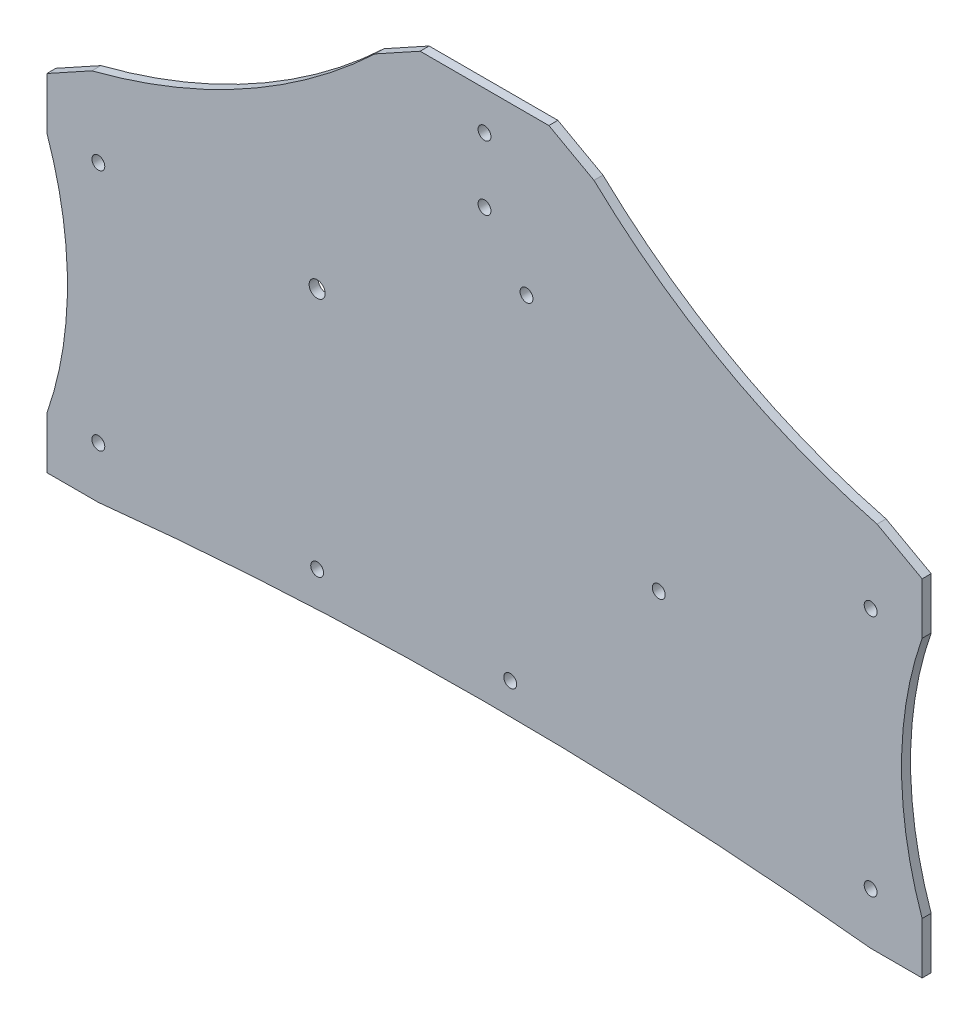
ISO-10303-21;
HEADER;
FILE_DESCRIPTION(('STEP AP214'),'2;1');
FILE_NAME('part.step','',(''),(''),'','','');
FILE_SCHEMA(('AUTOMOTIVE_DESIGN { 1 0 10303 214 1 1 1 1 }'));
ENDSEC;
DATA;
#1=APPLICATION_CONTEXT('core data for automotive mechanical design processes');
#2=APPLICATION_PROTOCOL_DEFINITION('international standard','automotive_design',2000,#1);
#3=PRODUCT_CONTEXT('',#1,'mechanical');
#4=PRODUCT('Part','Part','',(#3));
#5=PRODUCT_RELATED_PRODUCT_CATEGORY('part','',(#4));
#6=PRODUCT_DEFINITION_FORMATION('','',#4);
#7=PRODUCT_DEFINITION_CONTEXT('part definition',#1,'design');
#8=PRODUCT_DEFINITION('design','',#6,#7);
#9=PRODUCT_DEFINITION_SHAPE('','',#8);
#10=(LENGTH_UNIT() NAMED_UNIT(*) SI_UNIT(.MILLI.,.METRE.));
#11=(NAMED_UNIT(*) PLANE_ANGLE_UNIT() SI_UNIT($,.RADIAN.));
#12=(NAMED_UNIT(*) SI_UNIT($,.STERADIAN.) SOLID_ANGLE_UNIT());
#13=UNCERTAINTY_MEASURE_WITH_UNIT(LENGTH_MEASURE(1.E-05),#10,'distance_accuracy_value','');
#14=(GEOMETRIC_REPRESENTATION_CONTEXT(3) GLOBAL_UNCERTAINTY_ASSIGNED_CONTEXT((#13)) GLOBAL_UNIT_ASSIGNED_CONTEXT((#10,
#11,#12)) REPRESENTATION_CONTEXT('',''));
#15=CARTESIAN_POINT('',(0.,0.,0.));
#16=DIRECTION('',(0.,0.,1.));
#17=DIRECTION('',(1.,0.,0.));
#18=AXIS2_PLACEMENT_3D('',#15,#16,#17);
#19=CARTESIAN_POINT('',(96.5614763976723,175.017675970781,0.));
#20=DIRECTION('',(-0.483077342911335,-0.875577684026794,0.));
#21=DIRECTION('',(0.875577684026794,-0.483077342911335,0.));
#22=AXIS2_PLACEMENT_3D('',#19,#20,#21);
#23=PLANE('',#22);
#24=DIRECTION('',(0.875577684026794,-0.483077342911335,0.));
#25=VECTOR('',#24,1.);
#26=CARTESIAN_POINT('',(96.5614763976723,175.017675970781,0.));
#27=LINE('',#26,#25);
#28=CARTESIAN_POINT('',(302.964986388948,61.1398773549049,0.));
#29=VERTEX_POINT('',#28);
#30=CARTESIAN_POINT('',(325.204659563228,48.8697128449571,0.));
#31=VERTEX_POINT('',#30);
#32=EDGE_CURVE('E156',#29,#31,#27,.T.);
#33=ORIENTED_EDGE('',*,*,#32,.F.);
#34=DIRECTION('',(0.,0.,1.));
#35=VECTOR('',#34,1.);
#36=CARTESIAN_POINT('',(302.964986388948,61.1398773549049,0.));
#37=LINE('',#36,#35);
#38=CARTESIAN_POINT('',(302.964986388948,61.1398773549049,4.445));
#39=VERTEX_POINT('',#38);
#40=EDGE_CURVE('E144',#29,#39,#37,.T.);
#41=ORIENTED_EDGE('',*,*,#40,.T.);
#42=DIRECTION('',(0.875577684026794,-0.483077342911335,0.));
#43=VECTOR('',#42,1.);
#44=CARTESIAN_POINT('',(96.5614763976723,175.017675970781,4.445));
#45=LINE('',#44,#43);
#46=CARTESIAN_POINT('',(325.204659563228,48.8697128449571,4.445));
#47=VERTEX_POINT('',#46);
#48=EDGE_CURVE('E195',#39,#47,#45,.T.);
#49=ORIENTED_EDGE('',*,*,#48,.T.);
#50=DIRECTION('',(0.,0.,1.));
#51=VECTOR('',#50,1.);
#52=CARTESIAN_POINT('',(325.204659563228,48.8697128449571,0.));
#53=LINE('',#52,#51);
#54=EDGE_CURVE('E163',#31,#47,#53,.T.);
#55=ORIENTED_EDGE('',*,*,#54,.F.);
#56=EDGE_LOOP('',(#33,#41,#49,#55));
#57=FACE_BOUND('',#56,.T.);
#58=ADVANCED_FACE('F33',(#57),#23,.F.);
#59=CARTESIAN_POINT('',(-45.5459926270498,82.5521116365277,0.));
#60=DIRECTION('',(-0.483077342911335,0.875577684026794,0.));
#61=DIRECTION('',(-0.875577684026794,-0.483077342911335,0.));
#62=AXIS2_PLACEMENT_3D('',#59,#60,#61);
#63=PLANE('',#62);
#64=DIRECTION('',(0.,0.,1.));
#65=VECTOR('',#64,1.);
#66=CARTESIAN_POINT('',(-84.3556672624911,61.1398773549049,0.));
#67=LINE('',#66,#65);
#68=CARTESIAN_POINT('',(-84.3556672624911,61.1398773549049,0.));
#69=VERTEX_POINT('',#68);
#70=CARTESIAN_POINT('',(-84.3556672624911,61.1398773549049,4.445));
#71=VERTEX_POINT('',#70);
#72=EDGE_CURVE('E386',#69,#71,#67,.T.);
#73=ORIENTED_EDGE('',*,*,#72,.F.);
#74=DIRECTION('',(-0.875577684026794,-0.483077342911335,0.));
#75=VECTOR('',#74,1.);
#76=CARTESIAN_POINT('',(-45.5459926270498,82.5521116365277,0.));
#77=LINE('',#76,#75);
#78=CARTESIAN_POINT('',(-106.595340436772,48.869712844957,0.));
#79=VERTEX_POINT('',#78);
#80=EDGE_CURVE('E185',#69,#79,#77,.T.);
#81=ORIENTED_EDGE('',*,*,#80,.T.);
#82=DIRECTION('',(0.,0.,1.));
#83=VECTOR('',#82,1.);
#84=CARTESIAN_POINT('',(-106.595340436772,48.869712844957,0.));
#85=LINE('',#84,#83);
#86=CARTESIAN_POINT('',(-106.595340436772,48.869712844957,4.445));
#87=VERTEX_POINT('',#86);
#88=EDGE_CURVE('E215',#79,#87,#85,.T.);
#89=ORIENTED_EDGE('',*,*,#88,.T.);
#90=DIRECTION('',(-0.875577684026794,-0.483077342911335,0.));
#91=VECTOR('',#90,1.);
#92=CARTESIAN_POINT('',(-45.5459926270498,82.5521116365277,4.445));
#93=LINE('',#92,#91);
#94=EDGE_CURVE('E207',#71,#87,#93,.T.);
#95=ORIENTED_EDGE('',*,*,#94,.F.);
#96=EDGE_LOOP('',(#73,#81,#89,#95));
#97=FACE_BOUND('',#96,.T.);
#98=ADVANCED_FACE('F311',(#97),#63,.T.);
#99=CARTESIAN_POINT('',(325.204659563228,1.05857574829678E-13,0.));
#100=DIRECTION('',(-1.,0.,0.));
#101=DIRECTION('',(0.,-1.,0.));
#102=AXIS2_PLACEMENT_3D('',#99,#100,#101);
#103=PLANE('',#102);
#104=DIRECTION('',(0.,-1.,0.));
#105=VECTOR('',#104,1.);
#106=CARTESIAN_POINT('',(325.204659563228,1.05857574829678E-13,0.));
#107=LINE('',#106,#105);
#108=CARTESIAN_POINT('',(325.204659563228,-96.265887155043,0.));
#109=VERTEX_POINT('',#108);
#110=CARTESIAN_POINT('',(325.204659563228,-121.665887155043,0.));
#111=VERTEX_POINT('',#110);
#112=EDGE_CURVE('E167',#109,#111,#107,.T.);
#113=ORIENTED_EDGE('',*,*,#112,.F.);
#114=DIRECTION('',(0.,0.,1.));
#115=VECTOR('',#114,1.);
#116=CARTESIAN_POINT('',(325.204659563228,-96.265887155043,0.));
#117=LINE('',#116,#115);
#118=CARTESIAN_POINT('',(325.204659563228,-96.265887155043,4.445));
#119=VERTEX_POINT('',#118);
#120=EDGE_CURVE('E397',#109,#119,#117,.T.);
#121=ORIENTED_EDGE('',*,*,#120,.T.);
#122=DIRECTION('',(0.,-1.,0.));
#123=VECTOR('',#122,1.);
#124=CARTESIAN_POINT('',(325.204659563228,1.05857574829678E-13,4.445));
#125=LINE('',#124,#123);
#126=CARTESIAN_POINT('',(325.204659563228,-121.665887155043,4.445));
#127=VERTEX_POINT('',#126);
#128=EDGE_CURVE('E194',#119,#127,#125,.T.);
#129=ORIENTED_EDGE('',*,*,#128,.T.);
#130=DIRECTION('',(0.,0.,1.));
#131=VECTOR('',#130,1.);
#132=CARTESIAN_POINT('',(325.204659563228,-121.665887155043,0.));
#133=LINE('',#132,#131);
#134=EDGE_CURVE('E220',#111,#127,#133,.T.);
#135=ORIENTED_EDGE('',*,*,#134,.F.);
#136=EDGE_LOOP('',(#113,#121,#129,#135));
#137=FACE_BOUND('',#136,.T.);
#138=ADVANCED_FACE('F315',(#137),#103,.F.);
#139=CARTESIAN_POINT('',(0.,0.,4.445));
#140=DIRECTION('',(0.,0.,1.));
#141=DIRECTION('',(1.,0.,0.));
#142=AXIS2_PLACEMENT_3D('',#139,#140,#141);
#143=PLANE('',#142);
#144=CARTESIAN_POINT('',(109.304659563228,99.669712844957,4.445));
#145=DIRECTION('',(0.,0.,1.));
#146=DIRECTION('',(1.,0.,0.));
#147=AXIS2_PLACEMENT_3D('',#144,#145,#146);
#148=CIRCLE('',#147,3.175);
#149=CARTESIAN_POINT('',(112.479659563228,99.669712844957,4.445));
#150=VERTEX_POINT('',#149);
#151=EDGE_CURVE('E370',#150,#150,#148,.T.);
#152=ORIENTED_EDGE('',*,*,#151,.F.);
#153=EDGE_LOOP('',(#152));
#154=FACE_BOUND('',#153,.T.);
#155=CARTESIAN_POINT('',(109.304659563228,131.419712844957,4.445));
#156=DIRECTION('',(0.,0.,1.));
#157=DIRECTION('',(1.,0.,0.));
#158=AXIS2_PLACEMENT_3D('',#155,#156,#157);
#159=CIRCLE('',#158,3.175);
#160=CARTESIAN_POINT('',(112.479659563228,131.419712844957,4.445));
#161=VERTEX_POINT('',#160);
#162=EDGE_CURVE('E373',#161,#161,#159,.T.);
#163=ORIENTED_EDGE('',*,*,#162,.F.);
#164=EDGE_LOOP('',(#163));
#165=FACE_BOUND('',#164,.T.);
#166=CARTESIAN_POINT('',(381.91119299033,369.336242181579,4.445));
#167=DIRECTION('',(0.,0.,1.));
#168=DIRECTION('',(1.,0.,0.));
#169=AXIS2_PLACEMENT_3D('',#166,#167,#168);
#170=CIRCLE('',#169,318.146983058342);
#171=CARTESIAN_POINT('',(163.294332737509,138.199548335009,4.445));
#172=VERTEX_POINT('',#171);
#173=EDGE_CURVE('E147',#172,#39,#170,.T.);
#174=ORIENTED_EDGE('',*,*,#173,.F.);
#175=CARTESIAN_POINT('',(141.054659563228,150.469712844957,4.445));
#176=VERTEX_POINT('',#175);
#177=EDGE_CURVE('E191',#176,#172,#45,.T.);
#178=ORIENTED_EDGE('',*,*,#177,.F.);
#179=DIRECTION('',(1.,0.,0.));
#180=VECTOR('',#179,1.);
#181=CARTESIAN_POINT('',(0.,150.469712844957,4.445));
#182=LINE('',#181,#180);
#183=CARTESIAN_POINT('',(77.5546595632283,150.469712844957,4.445));
#184=VERTEX_POINT('',#183);
#185=EDGE_CURVE('E165',#184,#176,#182,.T.);
#186=ORIENTED_EDGE('',*,*,#185,.F.);
#187=CARTESIAN_POINT('',(55.3149863889478,138.199548335009,4.445));
#188=VERTEX_POINT('',#187);
#189=EDGE_CURVE('E169',#184,#188,#93,.T.);
#190=ORIENTED_EDGE('',*,*,#189,.T.);
#191=CARTESIAN_POINT('',(-163.301873863874,369.33624218158,4.445));
#192=DIRECTION('',(0.,0.,1.));
#193=DIRECTION('',(1.,0.,0.));
#194=AXIS2_PLACEMENT_3D('',#191,#192,#193);
#195=CIRCLE('',#194,318.146983058342);
#196=EDGE_CURVE('E56',#71,#188,#195,.T.);
#197=ORIENTED_EDGE('',*,*,#196,.F.);
#198=ORIENTED_EDGE('',*,*,#94,.T.);
#199=DIRECTION('',(0.,1.,0.));
#200=VECTOR('',#199,1.);
#201=CARTESIAN_POINT('',(-106.595340436772,0.,4.445));
#202=LINE('',#201,#200);
#203=CARTESIAN_POINT('',(-106.595340436772,23.469712844957,4.445));
#204=VERTEX_POINT('',#203);
#205=EDGE_CURVE('E203',#204,#87,#202,.T.);
#206=ORIENTED_EDGE('',*,*,#205,.F.);
#207=CARTESIAN_POINT('',(-277.900846186771,-36.398087155043,4.445));
#208=DIRECTION('',(0.,0.,1.));
#209=DIRECTION('',(1.,0.,0.));
#210=AXIS2_PLACEMENT_3D('',#207,#208,#209);
#211=CIRCLE('',#210,181.46550575);
#212=CARTESIAN_POINT('',(-106.595340436772,-96.265887155043,4.445));
#213=VERTEX_POINT('',#212);
#214=EDGE_CURVE('E409',#213,#204,#211,.T.);
#215=ORIENTED_EDGE('',*,*,#214,.F.);
#216=CARTESIAN_POINT('',(-106.595340436772,-121.665887155043,4.445));
#217=VERTEX_POINT('',#216);
#218=EDGE_CURVE('E204',#217,#213,#202,.T.);
#219=ORIENTED_EDGE('',*,*,#218,.F.);
#220=DIRECTION('',(1.,0.,0.));
#221=VECTOR('',#220,1.);
#222=CARTESIAN_POINT('',(0.,-121.665887155043,4.445));
#223=LINE('',#222,#221);
#224=CARTESIAN_POINT('',(-81.1953404367717,-121.665887155043,4.445));
#225=VERTEX_POINT('',#224);
#226=EDGE_CURVE('E200',#217,#225,#223,.T.);
#227=ORIENTED_EDGE('',*,*,#226,.T.);
#228=CARTESIAN_POINT('',(109.304659563229,-1902.52338715505,4.445));
#229=DIRECTION('',(0.,0.,1.));
#230=DIRECTION('',(1.,0.,0.));
#231=AXIS2_PLACEMENT_3D('',#228,#229,#230);
#232=CIRCLE('',#231,1791.01750000001);
#233=CARTESIAN_POINT('',(299.804659563228,-121.665887155043,4.445));
#234=VERTEX_POINT('',#233);
#235=EDGE_CURVE('E400',#225,#234,#232,.F.);
#236=ORIENTED_EDGE('',*,*,#235,.T.);
#237=EDGE_CURVE('E199',#234,#127,#223,.T.);
#238=ORIENTED_EDGE('',*,*,#237,.T.);
#239=ORIENTED_EDGE('',*,*,#128,.F.);
#240=CARTESIAN_POINT('',(496.510165313228,-36.3980871550429,4.445));
#241=DIRECTION('',(0.,0.,1.));
#242=DIRECTION('',(1.,0.,0.));
#243=AXIS2_PLACEMENT_3D('',#240,#241,#242);
#244=CIRCLE('',#243,181.465505749999);
#245=CARTESIAN_POINT('',(325.204659563228,23.469712844957,4.445));
#246=VERTEX_POINT('',#245);
#247=EDGE_CURVE('E390',#246,#119,#244,.T.);
#248=ORIENTED_EDGE('',*,*,#247,.F.);
#249=EDGE_CURVE('E196',#47,#246,#125,.T.);
#250=ORIENTED_EDGE('',*,*,#249,.F.);
#251=ORIENTED_EDGE('',*,*,#48,.F.);
#252=EDGE_LOOP('',(#174,#178,#186,#190,#197,#198,#206,#215,#219,#227,#236,#238,#239,#248,#250,#251));
#253=FACE_BOUND('',#252,.T.);
#254=CARTESIAN_POINT('',(130.026518129716,72.4535186201645,4.445));
#255=DIRECTION('',(0.,0.,-1.));
#256=DIRECTION('',(-1.,0.,0.));
#257=AXIS2_PLACEMENT_3D('',#254,#255,#256);
#258=CIRCLE('',#257,3.175);
#259=CARTESIAN_POINT('',(126.851518129716,72.4535186201645,4.445));
#260=VERTEX_POINT('',#259);
#261=EDGE_CURVE('E11',#260,#260,#258,.T.);
#262=ORIENTED_EDGE('',*,*,#261,.T.);
#263=EDGE_LOOP('',(#262));
#264=FACE_BOUND('',#263,.T.);
#265=CARTESIAN_POINT('',(195.288059763351,-21.3836871332233,4.445));
#266=DIRECTION('',(0.,0.,-1.));
#267=DIRECTION('',(-1.,0.,0.));
#268=AXIS2_PLACEMENT_3D('',#265,#266,#267);
#269=CIRCLE('',#268,3.17499999999997);
#270=CARTESIAN_POINT('',(192.113059763351,-21.3836871332233,4.445));
#271=VERTEX_POINT('',#270);
#272=EDGE_CURVE('E266',#271,#271,#269,.T.);
#273=ORIENTED_EDGE('',*,*,#272,.T.);
#274=EDGE_LOOP('',(#273));
#275=FACE_BOUND('',#274,.T.);
#276=CARTESIAN_POINT('',(122.004659563229,-96.265887155043,4.445));
#277=DIRECTION('',(0.,0.,-1.));
#278=DIRECTION('',(-1.,0.,0.));
#279=AXIS2_PLACEMENT_3D('',#276,#277,#278);
#280=CIRCLE('',#279,3.175);
#281=CARTESIAN_POINT('',(118.829659563229,-96.265887155043,4.445));
#282=VERTEX_POINT('',#281);
#283=EDGE_CURVE('E260',#282,#282,#280,.T.);
#284=ORIENTED_EDGE('',*,*,#283,.T.);
#285=EDGE_LOOP('',(#284));
#286=FACE_BOUND('',#285,.T.);
#287=CARTESIAN_POINT('',(26.7546595632283,-96.265887155043,4.445));
#288=DIRECTION('',(0.,0.,-1.));
#289=DIRECTION('',(-1.,0.,0.));
#290=AXIS2_PLACEMENT_3D('',#287,#288,#289);
#291=CIRCLE('',#290,3.175);
#292=CARTESIAN_POINT('',(23.5796595632283,-96.265887155043,4.445));
#293=VERTEX_POINT('',#292);
#294=EDGE_CURVE('E254',#293,#293,#291,.T.);
#295=ORIENTED_EDGE('',*,*,#294,.T.);
#296=EDGE_LOOP('',(#295));
#297=FACE_BOUND('',#296,.T.);
#298=CARTESIAN_POINT('',(26.7546595632283,23.469712844957,4.445));
#299=DIRECTION('',(0.,0.,-1.));
#300=DIRECTION('',(-1.,0.,0.));
#301=AXIS2_PLACEMENT_3D('',#298,#299,#300);
#302=CIRCLE('',#301,3.97509999999999);
#303=CARTESIAN_POINT('',(22.7795595632283,23.469712844957,4.445));
#304=VERTEX_POINT('',#303);
#305=EDGE_CURVE('E248',#304,#304,#302,.T.);
#306=ORIENTED_EDGE('',*,*,#305,.T.);
#307=EDGE_LOOP('',(#306));
#308=FACE_BOUND('',#307,.T.);
#309=CARTESIAN_POINT('',(-81.1953404367717,-96.265887155043,4.445));
#310=DIRECTION('',(0.,0.,-1.));
#311=DIRECTION('',(-1.,0.,0.));
#312=AXIS2_PLACEMENT_3D('',#309,#310,#311);
#313=CIRCLE('',#312,3.17499999999997);
#314=CARTESIAN_POINT('',(-84.3703404367716,-96.265887155043,4.445));
#315=VERTEX_POINT('',#314);
#316=EDGE_CURVE('E242',#315,#315,#313,.T.);
#317=ORIENTED_EDGE('',*,*,#316,.T.);
#318=EDGE_LOOP('',(#317));
#319=FACE_BOUND('',#318,.T.);
#320=CARTESIAN_POINT('',(299.804659563228,-96.265887155043,4.445));
#321=DIRECTION('',(0.,0.,-1.));
#322=DIRECTION('',(-1.,0.,0.));
#323=AXIS2_PLACEMENT_3D('',#320,#321,#322);
#324=CIRCLE('',#323,3.17499999999997);
#325=CARTESIAN_POINT('',(296.629659563228,-96.265887155043,4.445));
#326=VERTEX_POINT('',#325);
#327=EDGE_CURVE('E236',#326,#326,#324,.T.);
#328=ORIENTED_EDGE('',*,*,#327,.T.);
#329=EDGE_LOOP('',(#328));
#330=FACE_BOUND('',#329,.T.);
#331=CARTESIAN_POINT('',(-81.1953404367717,23.469712844957,4.445));
#332=DIRECTION('',(0.,0.,-1.));
#333=DIRECTION('',(-1.,0.,0.));
#334=AXIS2_PLACEMENT_3D('',#331,#332,#333);
#335=CIRCLE('',#334,3.175);
#336=CARTESIAN_POINT('',(-84.3703404367717,23.469712844957,4.445));
#337=VERTEX_POINT('',#336);
#338=EDGE_CURVE('E230',#337,#337,#335,.T.);
#339=ORIENTED_EDGE('',*,*,#338,.T.);
#340=EDGE_LOOP('',(#339));
#341=FACE_BOUND('',#340,.T.);
#342=CARTESIAN_POINT('',(299.804659563228,23.469712844957,4.445));
#343=DIRECTION('',(0.,0.,-1.));
#344=DIRECTION('',(-1.,0.,0.));
#345=AXIS2_PLACEMENT_3D('',#342,#343,#344);
#346=CIRCLE('',#345,3.17499999999997);
#347=CARTESIAN_POINT('',(296.629659563228,23.469712844957,4.445));
#348=VERTEX_POINT('',#347);
#349=EDGE_CURVE('E224',#348,#348,#346,.T.);
#350=ORIENTED_EDGE('',*,*,#349,.T.);
#351=EDGE_LOOP('',(#350));
#352=FACE_BOUND('',#351,.T.);
#353=ADVANCED_FACE('F277',(#154,#165,#253,#264,#275,#286,#297,#308,#319,#330,#341,#352),#143,.T.);
#354=CARTESIAN_POINT('',(0.,0.,0.));
#355=DIRECTION('',(0.,0.,1.));
#356=DIRECTION('',(1.,0.,0.));
#357=AXIS2_PLACEMENT_3D('',#354,#355,#356);
#358=PLANE('',#357);
#359=CARTESIAN_POINT('',(109.304659563228,99.669712844957,0.));
#360=DIRECTION('',(0.,0.,1.));
#361=DIRECTION('',(1.,0.,0.));
#362=AXIS2_PLACEMENT_3D('',#359,#360,#361);
#363=CIRCLE('',#362,3.175);
#364=CARTESIAN_POINT('',(112.479659563228,99.669712844957,0.));
#365=VERTEX_POINT('',#364);
#366=EDGE_CURVE('E367',#365,#365,#363,.T.);
#367=ORIENTED_EDGE('',*,*,#366,.T.);
#368=EDGE_LOOP('',(#367));
#369=FACE_BOUND('',#368,.T.);
#370=CARTESIAN_POINT('',(109.304659563228,131.419712844957,0.));
#371=DIRECTION('',(0.,0.,1.));
#372=DIRECTION('',(1.,0.,0.));
#373=AXIS2_PLACEMENT_3D('',#370,#371,#372);
#374=CIRCLE('',#373,3.175);
#375=CARTESIAN_POINT('',(112.479659563228,131.419712844957,0.));
#376=VERTEX_POINT('',#375);
#377=EDGE_CURVE('E376',#376,#376,#374,.T.);
#378=ORIENTED_EDGE('',*,*,#377,.T.);
#379=EDGE_LOOP('',(#378));
#380=FACE_BOUND('',#379,.T.);
#381=CARTESIAN_POINT('',(130.026518129716,72.4535186201645,0.));
#382=DIRECTION('',(0.,0.,-1.));
#383=DIRECTION('',(-1.,0.,0.));
#384=AXIS2_PLACEMENT_3D('',#381,#382,#383);
#385=CIRCLE('',#384,3.175);
#386=CARTESIAN_POINT('',(126.851518129716,72.4535186201645,0.));
#387=VERTEX_POINT('',#386);
#388=EDGE_CURVE('E37',#387,#387,#385,.T.);
#389=ORIENTED_EDGE('',*,*,#388,.F.);
#390=EDGE_LOOP('',(#389));
#391=FACE_BOUND('',#390,.T.);
#392=CARTESIAN_POINT('',(195.288059763351,-21.3836871332233,0.));
#393=DIRECTION('',(0.,0.,-1.));
#394=DIRECTION('',(-1.,0.,0.));
#395=AXIS2_PLACEMENT_3D('',#392,#393,#394);
#396=CIRCLE('',#395,3.17499999999997);
#397=CARTESIAN_POINT('',(192.113059763351,-21.3836871332233,0.));
#398=VERTEX_POINT('',#397);
#399=EDGE_CURVE('E263',#398,#398,#396,.T.);
#400=ORIENTED_EDGE('',*,*,#399,.F.);
#401=EDGE_LOOP('',(#400));
#402=FACE_BOUND('',#401,.T.);
#403=CARTESIAN_POINT('',(122.004659563229,-96.265887155043,0.));
#404=DIRECTION('',(0.,0.,-1.));
#405=DIRECTION('',(-1.,0.,0.));
#406=AXIS2_PLACEMENT_3D('',#403,#404,#405);
#407=CIRCLE('',#406,3.175);
#408=CARTESIAN_POINT('',(118.829659563229,-96.265887155043,0.));
#409=VERTEX_POINT('',#408);
#410=EDGE_CURVE('E257',#409,#409,#407,.T.);
#411=ORIENTED_EDGE('',*,*,#410,.F.);
#412=EDGE_LOOP('',(#411));
#413=FACE_BOUND('',#412,.T.);
#414=CARTESIAN_POINT('',(26.7546595632283,-96.265887155043,0.));
#415=DIRECTION('',(0.,0.,-1.));
#416=DIRECTION('',(-1.,0.,0.));
#417=AXIS2_PLACEMENT_3D('',#414,#415,#416);
#418=CIRCLE('',#417,3.175);
#419=CARTESIAN_POINT('',(23.5796595632283,-96.265887155043,0.));
#420=VERTEX_POINT('',#419);
#421=EDGE_CURVE('E251',#420,#420,#418,.T.);
#422=ORIENTED_EDGE('',*,*,#421,.F.);
#423=EDGE_LOOP('',(#422));
#424=FACE_BOUND('',#423,.T.);
#425=CARTESIAN_POINT('',(26.7546595632283,23.469712844957,0.));
#426=DIRECTION('',(0.,0.,-1.));
#427=DIRECTION('',(-1.,0.,0.));
#428=AXIS2_PLACEMENT_3D('',#425,#426,#427);
#429=CIRCLE('',#428,3.97509999999999);
#430=CARTESIAN_POINT('',(22.7795595632283,23.469712844957,0.));
#431=VERTEX_POINT('',#430);
#432=EDGE_CURVE('E245',#431,#431,#429,.T.);
#433=ORIENTED_EDGE('',*,*,#432,.F.);
#434=EDGE_LOOP('',(#433));
#435=FACE_BOUND('',#434,.T.);
#436=CARTESIAN_POINT('',(-81.1953404367717,-96.265887155043,0.));
#437=DIRECTION('',(0.,0.,-1.));
#438=DIRECTION('',(-1.,0.,0.));
#439=AXIS2_PLACEMENT_3D('',#436,#437,#438);
#440=CIRCLE('',#439,3.17499999999997);
#441=CARTESIAN_POINT('',(-84.3703404367716,-96.265887155043,0.));
#442=VERTEX_POINT('',#441);
#443=EDGE_CURVE('E239',#442,#442,#440,.T.);
#444=ORIENTED_EDGE('',*,*,#443,.F.);
#445=EDGE_LOOP('',(#444));
#446=FACE_BOUND('',#445,.T.);
#447=CARTESIAN_POINT('',(299.804659563228,-96.265887155043,0.));
#448=DIRECTION('',(0.,0.,-1.));
#449=DIRECTION('',(-1.,0.,0.));
#450=AXIS2_PLACEMENT_3D('',#447,#448,#449);
#451=CIRCLE('',#450,3.17499999999997);
#452=CARTESIAN_POINT('',(296.629659563228,-96.265887155043,0.));
#453=VERTEX_POINT('',#452);
#454=EDGE_CURVE('E233',#453,#453,#451,.T.);
#455=ORIENTED_EDGE('',*,*,#454,.F.);
#456=EDGE_LOOP('',(#455));
#457=FACE_BOUND('',#456,.T.);
#458=CARTESIAN_POINT('',(-81.1953404367717,23.469712844957,0.));
#459=DIRECTION('',(0.,0.,-1.));
#460=DIRECTION('',(-1.,0.,0.));
#461=AXIS2_PLACEMENT_3D('',#458,#459,#460);
#462=CIRCLE('',#461,3.175);
#463=CARTESIAN_POINT('',(-84.3703404367717,23.469712844957,0.));
#464=VERTEX_POINT('',#463);
#465=EDGE_CURVE('E227',#464,#464,#462,.T.);
#466=ORIENTED_EDGE('',*,*,#465,.F.);
#467=EDGE_LOOP('',(#466));
#468=FACE_BOUND('',#467,.T.);
#469=CARTESIAN_POINT('',(299.804659563228,23.469712844957,0.));
#470=DIRECTION('',(0.,0.,-1.));
#471=DIRECTION('',(-1.,0.,0.));
#472=AXIS2_PLACEMENT_3D('',#469,#470,#471);
#473=CIRCLE('',#472,3.17499999999997);
#474=CARTESIAN_POINT('',(296.629659563228,23.469712844957,0.));
#475=VERTEX_POINT('',#474);
#476=EDGE_CURVE('E212',#475,#475,#473,.T.);
#477=ORIENTED_EDGE('',*,*,#476,.F.);
#478=EDGE_LOOP('',(#477));
#479=FACE_BOUND('',#478,.T.);
#480=CARTESIAN_POINT('',(141.054659563228,150.469712844957,0.));
#481=VERTEX_POINT('',#480);
#482=CARTESIAN_POINT('',(163.294332737509,138.199548335009,0.));
#483=VERTEX_POINT('',#482);
#484=EDGE_CURVE('E160',#481,#483,#27,.T.);
#485=ORIENTED_EDGE('',*,*,#484,.T.);
#486=CARTESIAN_POINT('',(381.91119299033,369.336242181579,0.));
#487=DIRECTION('',(0.,0.,1.));
#488=DIRECTION('',(1.,0.,0.));
#489=AXIS2_PLACEMENT_3D('',#486,#487,#488);
#490=CIRCLE('',#489,318.146983058342);
#491=EDGE_CURVE('E48',#483,#29,#490,.T.);
#492=ORIENTED_EDGE('',*,*,#491,.T.);
#493=ORIENTED_EDGE('',*,*,#32,.T.);
#494=CARTESIAN_POINT('',(325.204659563228,23.469712844957,0.));
#495=VERTEX_POINT('',#494);
#496=EDGE_CURVE('E175',#31,#495,#107,.T.);
#497=ORIENTED_EDGE('',*,*,#496,.T.);
#498=CARTESIAN_POINT('',(496.510165313228,-36.3980871550429,0.));
#499=DIRECTION('',(0.,0.,1.));
#500=DIRECTION('',(1.,0.,0.));
#501=AXIS2_PLACEMENT_3D('',#498,#499,#500);
#502=CIRCLE('',#501,181.465505749999);
#503=EDGE_CURVE('E392',#495,#109,#502,.T.);
#504=ORIENTED_EDGE('',*,*,#503,.T.);
#505=ORIENTED_EDGE('',*,*,#112,.T.);
#506=DIRECTION('',(1.,0.,0.));
#507=VECTOR('',#506,1.);
#508=CARTESIAN_POINT('',(0.,-121.665887155043,0.));
#509=LINE('',#508,#507);
#510=CARTESIAN_POINT('',(299.804659563228,-121.665887155043,0.));
#511=VERTEX_POINT('',#510);
#512=EDGE_CURVE('E177',#511,#111,#509,.T.);
#513=ORIENTED_EDGE('',*,*,#512,.F.);
#514=CARTESIAN_POINT('',(109.304659563229,-1902.52338715505,0.));
#515=DIRECTION('',(0.,0.,1.));
#516=DIRECTION('',(1.,0.,0.));
#517=AXIS2_PLACEMENT_3D('',#514,#515,#516);
#518=CIRCLE('',#517,1791.01750000001);
#519=CARTESIAN_POINT('',(-81.1953404367717,-121.665887155043,0.));
#520=VERTEX_POINT('',#519);
#521=EDGE_CURVE('E402',#520,#511,#518,.F.);
#522=ORIENTED_EDGE('',*,*,#521,.F.);
#523=CARTESIAN_POINT('',(-106.595340436772,-121.665887155043,0.));
#524=VERTEX_POINT('',#523);
#525=EDGE_CURVE('E178',#524,#520,#509,.T.);
#526=ORIENTED_EDGE('',*,*,#525,.F.);
#527=DIRECTION('',(0.,1.,0.));
#528=VECTOR('',#527,1.);
#529=CARTESIAN_POINT('',(-106.595340436772,0.,0.));
#530=LINE('',#529,#528);
#531=CARTESIAN_POINT('',(-106.595340436772,-96.265887155043,0.));
#532=VERTEX_POINT('',#531);
#533=EDGE_CURVE('E182',#524,#532,#530,.T.);
#534=ORIENTED_EDGE('',*,*,#533,.T.);
#535=CARTESIAN_POINT('',(-277.900846186771,-36.398087155043,0.));
#536=DIRECTION('',(0.,0.,1.));
#537=DIRECTION('',(1.,0.,0.));
#538=AXIS2_PLACEMENT_3D('',#535,#536,#537);
#539=CIRCLE('',#538,181.46550575);
#540=CARTESIAN_POINT('',(-106.595340436772,23.469712844957,0.));
#541=VERTEX_POINT('',#540);
#542=EDGE_CURVE('E412',#532,#541,#539,.T.);
#543=ORIENTED_EDGE('',*,*,#542,.T.);
#544=EDGE_CURVE('E181',#541,#79,#530,.T.);
#545=ORIENTED_EDGE('',*,*,#544,.T.);
#546=ORIENTED_EDGE('',*,*,#80,.F.);
#547=CARTESIAN_POINT('',(-163.301873863874,369.33624218158,0.));
#548=DIRECTION('',(0.,0.,1.));
#549=DIRECTION('',(1.,0.,0.));
#550=AXIS2_PLACEMENT_3D('',#547,#548,#549);
#551=CIRCLE('',#550,318.146983058342);
#552=CARTESIAN_POINT('',(55.3149863889477,138.199548335009,0.));
#553=VERTEX_POINT('',#552);
#554=EDGE_CURVE('E383',#69,#553,#551,.T.);
#555=ORIENTED_EDGE('',*,*,#554,.T.);
#556=CARTESIAN_POINT('',(77.5546595632283,150.469712844957,0.));
#557=VERTEX_POINT('',#556);
#558=EDGE_CURVE('E186',#557,#553,#77,.T.);
#559=ORIENTED_EDGE('',*,*,#558,.F.);
#560=DIRECTION('',(1.,0.,0.));
#561=VECTOR('',#560,1.);
#562=CARTESIAN_POINT('',(0.,150.469712844957,0.));
#563=LINE('',#562,#561);
#564=EDGE_CURVE('E189',#557,#481,#563,.T.);
#565=ORIENTED_EDGE('',*,*,#564,.T.);
#566=EDGE_LOOP('',(#485,#492,#493,#497,#504,#505,#513,#522,#526,#534,#543,#545,#546,#555,#559,#565));
#567=FACE_BOUND('',#566,.T.);
#568=ADVANCED_FACE('F35',(#369,#380,#391,#402,#413,#424,#435,#446,#457,#468,#479,#567),#358,.F.);
#569=CARTESIAN_POINT('',(0.,-121.665887155043,0.));
#570=DIRECTION('',(0.,-1.,0.));
#571=DIRECTION('',(0.,0.,-1.));
#572=AXIS2_PLACEMENT_3D('',#569,#570,#571);
#573=PLANE('',#572);
#574=ORIENTED_EDGE('',*,*,#237,.F.);
#575=DIRECTION('',(0.,0.,1.));
#576=VECTOR('',#575,1.);
#577=CARTESIAN_POINT('',(299.804659563228,-121.665887155043,0.));
#578=LINE('',#577,#576);
#579=EDGE_CURVE('E407',#511,#234,#578,.T.);
#580=ORIENTED_EDGE('',*,*,#579,.F.);
#581=ORIENTED_EDGE('',*,*,#512,.T.);
#582=ORIENTED_EDGE('',*,*,#134,.T.);
#583=EDGE_LOOP('',(#574,#580,#581,#582));
#584=FACE_BOUND('',#583,.T.);
#585=ADVANCED_FACE('F276',(#584),#573,.T.);
#586=ORIENTED_EDGE('',*,*,#525,.T.);
#587=DIRECTION('',(0.,0.,1.));
#588=VECTOR('',#587,1.);
#589=CARTESIAN_POINT('',(-81.1953404367717,-121.665887155043,0.));
#590=LINE('',#589,#588);
#591=EDGE_CURVE('E404',#520,#225,#590,.T.);
#592=ORIENTED_EDGE('',*,*,#591,.T.);
#593=ORIENTED_EDGE('',*,*,#226,.F.);
#594=DIRECTION('',(0.,0.,1.));
#595=VECTOR('',#594,1.);
#596=CARTESIAN_POINT('',(-106.595340436772,-121.665887155043,0.));
#597=LINE('',#596,#595);
#598=EDGE_CURVE('E218',#524,#217,#597,.T.);
#599=ORIENTED_EDGE('',*,*,#598,.F.);
#600=EDGE_LOOP('',(#586,#592,#593,#599));
#601=FACE_BOUND('',#600,.T.);
#602=ADVANCED_FACE('F328',(#601),#573,.T.);
#603=CARTESIAN_POINT('',(-106.595340436772,0.,0.));
#604=DIRECTION('',(1.,0.,0.));
#605=DIRECTION('',(0.,0.,-1.));
#606=AXIS2_PLACEMENT_3D('',#603,#604,#605);
#607=PLANE('',#606);
#608=ORIENTED_EDGE('',*,*,#544,.F.);
#609=DIRECTION('',(0.,0.,1.));
#610=VECTOR('',#609,1.);
#611=CARTESIAN_POINT('',(-106.595340436772,23.469712844957,0.));
#612=LINE('',#611,#610);
#613=EDGE_CURVE('E415',#541,#204,#612,.T.);
#614=ORIENTED_EDGE('',*,*,#613,.T.);
#615=ORIENTED_EDGE('',*,*,#205,.T.);
#616=ORIENTED_EDGE('',*,*,#88,.F.);
#617=EDGE_LOOP('',(#608,#614,#615,#616));
#618=FACE_BOUND('',#617,.T.);
#619=ADVANCED_FACE('F332',(#618),#607,.F.);
#620=CARTESIAN_POINT('',(130.026518129716,72.4535186201645,4.445));
#621=DIRECTION('',(0.,0.,-1.));
#622=DIRECTION('',(-1.,0.,0.));
#623=AXIS2_PLACEMENT_3D('',#620,#621,#622);
#624=CYLINDRICAL_SURFACE('',#623,3.175);
#625=ORIENTED_EDGE('',*,*,#261,.F.);
#626=EDGE_LOOP('',(#625));
#627=FACE_BOUND('',#626,.T.);
#628=ORIENTED_EDGE('',*,*,#388,.T.);
#629=EDGE_LOOP('',(#628));
#630=FACE_BOUND('',#629,.T.);
#631=ADVANCED_FACE('F454',(#627,#630),#624,.F.);
#632=CARTESIAN_POINT('',(195.288059763351,-21.3836871332233,4.445));
#633=DIRECTION('',(0.,0.,-1.));
#634=DIRECTION('',(-1.,0.,0.));
#635=AXIS2_PLACEMENT_3D('',#632,#633,#634);
#636=CYLINDRICAL_SURFACE('',#635,3.17499999999997);
#637=ORIENTED_EDGE('',*,*,#272,.F.);
#638=EDGE_LOOP('',(#637));
#639=FACE_BOUND('',#638,.T.);
#640=ORIENTED_EDGE('',*,*,#399,.T.);
#641=EDGE_LOOP('',(#640));
#642=FACE_BOUND('',#641,.T.);
#643=ADVANCED_FACE('F272',(#639,#642),#636,.F.);
#644=CARTESIAN_POINT('',(122.004659563229,-96.265887155043,4.445));
#645=DIRECTION('',(0.,0.,-1.));
#646=DIRECTION('',(-1.,0.,0.));
#647=AXIS2_PLACEMENT_3D('',#644,#645,#646);
#648=CYLINDRICAL_SURFACE('',#647,3.175);
#649=ORIENTED_EDGE('',*,*,#283,.F.);
#650=EDGE_LOOP('',(#649));
#651=FACE_BOUND('',#650,.T.);
#652=ORIENTED_EDGE('',*,*,#410,.T.);
#653=EDGE_LOOP('',(#652));
#654=FACE_BOUND('',#653,.T.);
#655=ADVANCED_FACE('F549',(#651,#654),#648,.F.);
#656=CARTESIAN_POINT('',(26.7546595632283,-96.265887155043,4.445));
#657=DIRECTION('',(0.,0.,-1.));
#658=DIRECTION('',(-1.,0.,0.));
#659=AXIS2_PLACEMENT_3D('',#656,#657,#658);
#660=CYLINDRICAL_SURFACE('',#659,3.175);
#661=ORIENTED_EDGE('',*,*,#294,.F.);
#662=EDGE_LOOP('',(#661));
#663=FACE_BOUND('',#662,.T.);
#664=ORIENTED_EDGE('',*,*,#421,.T.);
#665=EDGE_LOOP('',(#664));
#666=FACE_BOUND('',#665,.T.);
#667=ADVANCED_FACE('F539',(#663,#666),#660,.F.);
#668=CARTESIAN_POINT('',(26.7546595632283,23.469712844957,4.445));
#669=DIRECTION('',(0.,0.,-1.));
#670=DIRECTION('',(-1.,0.,0.));
#671=AXIS2_PLACEMENT_3D('',#668,#669,#670);
#672=CYLINDRICAL_SURFACE('',#671,3.97509999999999);
#673=ORIENTED_EDGE('',*,*,#305,.F.);
#674=EDGE_LOOP('',(#673));
#675=FACE_BOUND('',#674,.T.);
#676=ORIENTED_EDGE('',*,*,#432,.T.);
#677=EDGE_LOOP('',(#676));
#678=FACE_BOUND('',#677,.T.);
#679=ADVANCED_FACE('F529',(#675,#678),#672,.F.);
#680=CARTESIAN_POINT('',(-81.1953404367717,-96.265887155043,4.445));
#681=DIRECTION('',(0.,0.,-1.));
#682=DIRECTION('',(-1.,0.,0.));
#683=AXIS2_PLACEMENT_3D('',#680,#681,#682);
#684=CYLINDRICAL_SURFACE('',#683,3.17499999999997);
#685=ORIENTED_EDGE('',*,*,#316,.F.);
#686=EDGE_LOOP('',(#685));
#687=FACE_BOUND('',#686,.T.);
#688=ORIENTED_EDGE('',*,*,#443,.T.);
#689=EDGE_LOOP('',(#688));
#690=FACE_BOUND('',#689,.T.);
#691=ADVANCED_FACE('F519',(#687,#690),#684,.F.);
#692=CARTESIAN_POINT('',(299.804659563228,-96.265887155043,4.445));
#693=DIRECTION('',(0.,0.,-1.));
#694=DIRECTION('',(-1.,0.,0.));
#695=AXIS2_PLACEMENT_3D('',#692,#693,#694);
#696=CYLINDRICAL_SURFACE('',#695,3.17499999999997);
#697=ORIENTED_EDGE('',*,*,#327,.F.);
#698=EDGE_LOOP('',(#697));
#699=FACE_BOUND('',#698,.T.);
#700=ORIENTED_EDGE('',*,*,#454,.T.);
#701=EDGE_LOOP('',(#700));
#702=FACE_BOUND('',#701,.T.);
#703=ADVANCED_FACE('F306',(#699,#702),#696,.F.);
#704=CARTESIAN_POINT('',(-81.1953404367717,23.469712844957,4.445));
#705=DIRECTION('',(0.,0.,-1.));
#706=DIRECTION('',(-1.,0.,0.));
#707=AXIS2_PLACEMENT_3D('',#704,#705,#706);
#708=CYLINDRICAL_SURFACE('',#707,3.175);
#709=ORIENTED_EDGE('',*,*,#338,.F.);
#710=EDGE_LOOP('',(#709));
#711=FACE_BOUND('',#710,.T.);
#712=ORIENTED_EDGE('',*,*,#465,.T.);
#713=EDGE_LOOP('',(#712));
#714=FACE_BOUND('',#713,.T.);
#715=ADVANCED_FACE('F296',(#711,#714),#708,.F.);
#716=CARTESIAN_POINT('',(299.804659563228,23.469712844957,4.445));
#717=DIRECTION('',(0.,0.,-1.));
#718=DIRECTION('',(-1.,0.,0.));
#719=AXIS2_PLACEMENT_3D('',#716,#717,#718);
#720=CYLINDRICAL_SURFACE('',#719,3.17499999999997);
#721=ORIENTED_EDGE('',*,*,#349,.F.);
#722=EDGE_LOOP('',(#721));
#723=FACE_BOUND('',#722,.T.);
#724=ORIENTED_EDGE('',*,*,#476,.T.);
#725=EDGE_LOOP('',(#724));
#726=FACE_BOUND('',#725,.T.);
#727=ADVANCED_FACE('F293',(#723,#726),#720,.F.);
#728=ORIENTED_EDGE('',*,*,#177,.T.);
#729=DIRECTION('',(0.,0.,1.));
#730=VECTOR('',#729,1.);
#731=CARTESIAN_POINT('',(163.294332737509,138.199548335009,0.));
#732=LINE('',#731,#730);
#733=EDGE_CURVE('E151',#483,#172,#732,.T.);
#734=ORIENTED_EDGE('',*,*,#733,.F.);
#735=ORIENTED_EDGE('',*,*,#484,.F.);
#736=DIRECTION('',(0.,0.,1.));
#737=VECTOR('',#736,1.);
#738=CARTESIAN_POINT('',(141.054659563228,150.469712844957,0.));
#739=LINE('',#738,#737);
#740=EDGE_CURVE('E210',#481,#176,#739,.T.);
#741=ORIENTED_EDGE('',*,*,#740,.T.);
#742=EDGE_LOOP('',(#728,#734,#735,#741));
#743=FACE_BOUND('',#742,.T.);
#744=ADVANCED_FACE('F295',(#743),#23,.F.);
#745=CARTESIAN_POINT('',(0.,150.469712844957,0.));
#746=DIRECTION('',(0.,-1.,0.));
#747=DIRECTION('',(0.,0.,-1.));
#748=AXIS2_PLACEMENT_3D('',#745,#746,#747);
#749=PLANE('',#748);
#750=ORIENTED_EDGE('',*,*,#185,.T.);
#751=ORIENTED_EDGE('',*,*,#740,.F.);
#752=ORIENTED_EDGE('',*,*,#564,.F.);
#753=DIRECTION('',(0.,0.,1.));
#754=VECTOR('',#753,1.);
#755=CARTESIAN_POINT('',(77.5546595632283,150.469712844957,0.));
#756=LINE('',#755,#754);
#757=EDGE_CURVE('E213',#557,#184,#756,.T.);
#758=ORIENTED_EDGE('',*,*,#757,.T.);
#759=EDGE_LOOP('',(#750,#751,#752,#758));
#760=FACE_BOUND('',#759,.T.);
#761=ADVANCED_FACE('F303',(#760),#749,.F.);
#762=DIRECTION('',(0.,0.,1.));
#763=VECTOR('',#762,1.);
#764=CARTESIAN_POINT('',(55.3149863889477,138.199548335009,0.));
#765=LINE('',#764,#763);
#766=EDGE_CURVE('E388',#553,#188,#765,.T.);
#767=ORIENTED_EDGE('',*,*,#766,.T.);
#768=ORIENTED_EDGE('',*,*,#189,.F.);
#769=ORIENTED_EDGE('',*,*,#757,.F.);
#770=ORIENTED_EDGE('',*,*,#558,.T.);
#771=EDGE_LOOP('',(#767,#768,#769,#770));
#772=FACE_BOUND('',#771,.T.);
#773=ADVANCED_FACE('F318',(#772),#63,.T.);
#774=ORIENTED_EDGE('',*,*,#218,.T.);
#775=DIRECTION('',(0.,0.,1.));
#776=VECTOR('',#775,1.);
#777=CARTESIAN_POINT('',(-106.595340436772,-96.265887155043,0.));
#778=LINE('',#777,#776);
#779=EDGE_CURVE('E173',#532,#213,#778,.T.);
#780=ORIENTED_EDGE('',*,*,#779,.F.);
#781=ORIENTED_EDGE('',*,*,#533,.F.);
#782=ORIENTED_EDGE('',*,*,#598,.T.);
#783=EDGE_LOOP('',(#774,#780,#781,#782));
#784=FACE_BOUND('',#783,.T.);
#785=ADVANCED_FACE('F324',(#784),#607,.F.);
#786=ORIENTED_EDGE('',*,*,#249,.T.);
#787=DIRECTION('',(0.,0.,1.));
#788=VECTOR('',#787,1.);
#789=CARTESIAN_POINT('',(325.204659563228,23.469712844957,0.));
#790=LINE('',#789,#788);
#791=EDGE_CURVE('E395',#495,#246,#790,.T.);
#792=ORIENTED_EDGE('',*,*,#791,.F.);
#793=ORIENTED_EDGE('',*,*,#496,.F.);
#794=ORIENTED_EDGE('',*,*,#54,.T.);
#795=EDGE_LOOP('',(#786,#792,#793,#794));
#796=FACE_BOUND('',#795,.T.);
#797=ADVANCED_FACE('F320',(#796),#103,.F.);
#798=CARTESIAN_POINT('',(-277.900846186771,-36.398087155043,0.));
#799=DIRECTION('',(0.,0.,1.));
#800=DIRECTION('',(1.,0.,0.));
#801=AXIS2_PLACEMENT_3D('',#798,#799,#800);
#802=CYLINDRICAL_SURFACE('',#801,181.46550575);
#803=ORIENTED_EDGE('',*,*,#214,.T.);
#804=ORIENTED_EDGE('',*,*,#613,.F.);
#805=ORIENTED_EDGE('',*,*,#542,.F.);
#806=ORIENTED_EDGE('',*,*,#779,.T.);
#807=EDGE_LOOP('',(#803,#804,#805,#806));
#808=FACE_BOUND('',#807,.T.);
#809=ADVANCED_FACE('F323',(#808),#802,.F.);
#810=CARTESIAN_POINT('',(109.304659563229,-1902.52338715505,0.));
#811=DIRECTION('',(0.,0.,1.));
#812=DIRECTION('',(1.,0.,0.));
#813=AXIS2_PLACEMENT_3D('',#810,#811,#812);
#814=CYLINDRICAL_SURFACE('',#813,1791.01750000001);
#815=ORIENTED_EDGE('',*,*,#235,.F.);
#816=ORIENTED_EDGE('',*,*,#591,.F.);
#817=ORIENTED_EDGE('',*,*,#521,.T.);
#818=ORIENTED_EDGE('',*,*,#579,.T.);
#819=EDGE_LOOP('',(#815,#816,#817,#818));
#820=FACE_BOUND('',#819,.T.);
#821=ADVANCED_FACE('F341',(#820),#814,.F.);
#822=CARTESIAN_POINT('',(496.510165313228,-36.3980871550429,0.));
#823=DIRECTION('',(0.,0.,1.));
#824=DIRECTION('',(1.,0.,0.));
#825=AXIS2_PLACEMENT_3D('',#822,#823,#824);
#826=CYLINDRICAL_SURFACE('',#825,181.465505749999);
#827=ORIENTED_EDGE('',*,*,#247,.T.);
#828=ORIENTED_EDGE('',*,*,#120,.F.);
#829=ORIENTED_EDGE('',*,*,#503,.F.);
#830=ORIENTED_EDGE('',*,*,#791,.T.);
#831=EDGE_LOOP('',(#827,#828,#829,#830));
#832=FACE_BOUND('',#831,.T.);
#833=ADVANCED_FACE('F345',(#832),#826,.F.);
#834=CARTESIAN_POINT('',(-163.301873863874,369.33624218158,0.));
#835=DIRECTION('',(0.,0.,1.));
#836=DIRECTION('',(1.,0.,0.));
#837=AXIS2_PLACEMENT_3D('',#834,#835,#836);
#838=CYLINDRICAL_SURFACE('',#837,318.146983058342);
#839=ORIENTED_EDGE('',*,*,#196,.T.);
#840=ORIENTED_EDGE('',*,*,#766,.F.);
#841=ORIENTED_EDGE('',*,*,#554,.F.);
#842=ORIENTED_EDGE('',*,*,#72,.T.);
#843=EDGE_LOOP('',(#839,#840,#841,#842));
#844=FACE_BOUND('',#843,.T.);
#845=ADVANCED_FACE('F349',(#844),#838,.F.);
#846=CARTESIAN_POINT('',(381.91119299033,369.336242181579,0.));
#847=DIRECTION('',(0.,0.,1.));
#848=DIRECTION('',(1.,0.,0.));
#849=AXIS2_PLACEMENT_3D('',#846,#847,#848);
#850=CYLINDRICAL_SURFACE('',#849,318.146983058342);
#851=ORIENTED_EDGE('',*,*,#173,.T.);
#852=ORIENTED_EDGE('',*,*,#40,.F.);
#853=ORIENTED_EDGE('',*,*,#491,.F.);
#854=ORIENTED_EDGE('',*,*,#733,.T.);
#855=EDGE_LOOP('',(#851,#852,#853,#854));
#856=FACE_BOUND('',#855,.T.);
#857=ADVANCED_FACE('F145',(#856),#850,.F.);
#858=CARTESIAN_POINT('',(109.304659563228,131.419712844957,0.));
#859=DIRECTION('',(0.,0.,1.));
#860=DIRECTION('',(1.,0.,0.));
#861=AXIS2_PLACEMENT_3D('',#858,#859,#860);
#862=CYLINDRICAL_SURFACE('',#861,3.175);
#863=ORIENTED_EDGE('',*,*,#377,.F.);
#864=EDGE_LOOP('',(#863));
#865=FACE_BOUND('',#864,.T.);
#866=ORIENTED_EDGE('',*,*,#162,.T.);
#867=EDGE_LOOP('',(#866));
#868=FACE_BOUND('',#867,.T.);
#869=ADVANCED_FACE('F355',(#865,#868),#862,.F.);
#870=CARTESIAN_POINT('',(109.304659563228,99.669712844957,0.));
#871=DIRECTION('',(0.,0.,1.));
#872=DIRECTION('',(1.,0.,0.));
#873=AXIS2_PLACEMENT_3D('',#870,#871,#872);
#874=CYLINDRICAL_SURFACE('',#873,3.175);
#875=ORIENTED_EDGE('',*,*,#366,.F.);
#876=EDGE_LOOP('',(#875));
#877=FACE_BOUND('',#876,.T.);
#878=ORIENTED_EDGE('',*,*,#151,.T.);
#879=EDGE_LOOP('',(#878));
#880=FACE_BOUND('',#879,.T.);
#881=ADVANCED_FACE('F358',(#877,#880),#874,.F.);
#882=CLOSED_SHELL('',(#58,#98,#138,#353,#568,#585,#602,#619,#631,#643,#655,#667,#679,#691,#703,
#715,#727,#744,#761,#773,#785,#797,#809,#821,#833,#845,#857,#869,#881));
#883=MANIFOLD_SOLID_BREP('B2',#882);
#884=ADVANCED_BREP_SHAPE_REPRESENTATION('',(#18,#883),#14);
#885=SHAPE_DEFINITION_REPRESENTATION(#9,#884);
ENDSEC;
END-ISO-10303-21;
